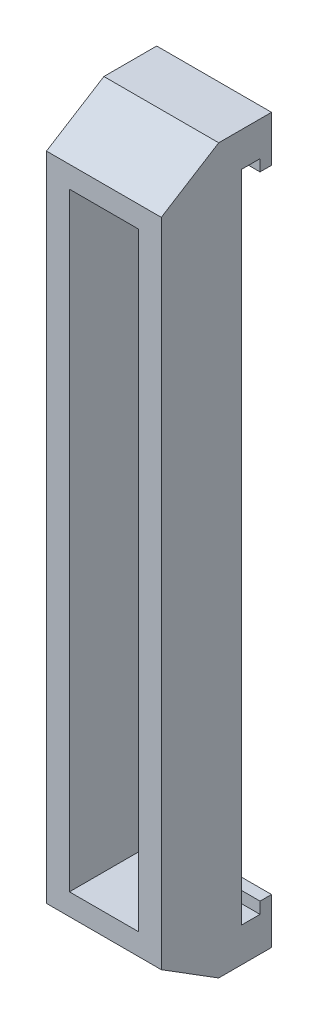
ISO-10303-21;
HEADER;
FILE_DESCRIPTION(('STEP AP214'),'2;1');
FILE_NAME('part.step','',(''),(''),'','','');
FILE_SCHEMA(('AUTOMOTIVE_DESIGN { 1 0 10303 214 1 1 1 1 }'));
ENDSEC;
DATA;
#1=APPLICATION_CONTEXT('core data for automotive mechanical design processes');
#2=APPLICATION_PROTOCOL_DEFINITION('international standard','automotive_design',2000,#1);
#3=PRODUCT_CONTEXT('',#1,'mechanical');
#4=PRODUCT('Part','Part','',(#3));
#5=PRODUCT_RELATED_PRODUCT_CATEGORY('part','',(#4));
#6=PRODUCT_DEFINITION_FORMATION('','',#4);
#7=PRODUCT_DEFINITION_CONTEXT('part definition',#1,'design');
#8=PRODUCT_DEFINITION('design','',#6,#7);
#9=PRODUCT_DEFINITION_SHAPE('','',#8);
#10=(LENGTH_UNIT() NAMED_UNIT(*) SI_UNIT(.MILLI.,.METRE.));
#11=(NAMED_UNIT(*) PLANE_ANGLE_UNIT() SI_UNIT($,.RADIAN.));
#12=(NAMED_UNIT(*) SI_UNIT($,.STERADIAN.) SOLID_ANGLE_UNIT());
#13=UNCERTAINTY_MEASURE_WITH_UNIT(LENGTH_MEASURE(1.E-05),#10,'distance_accuracy_value','');
#14=(GEOMETRIC_REPRESENTATION_CONTEXT(3) GLOBAL_UNCERTAINTY_ASSIGNED_CONTEXT((#13)) GLOBAL_UNIT_ASSIGNED_CONTEXT((#10,
#11,#12)) REPRESENTATION_CONTEXT('',''));
#15=CARTESIAN_POINT('',(0.,0.,0.));
#16=DIRECTION('',(0.,0.,1.));
#17=DIRECTION('',(1.,0.,0.));
#18=AXIS2_PLACEMENT_3D('',#15,#16,#17);
#19=CARTESIAN_POINT('',(0.,0.,7.));
#20=DIRECTION('',(1.,0.,0.));
#21=DIRECTION('',(0.,0.,-1.));
#22=AXIS2_PLACEMENT_3D('',#19,#20,#21);
#23=PLANE('',#22);
#24=DIRECTION('',(0.,0.,-1.));
#25=VECTOR('',#24,1.);
#26=CARTESIAN_POINT('',(0.,0.,7.));
#27=LINE('',#26,#25);
#28=CARTESIAN_POINT('',(0.,0.,1.99999999999997));
#29=VERTEX_POINT('',#28);
#30=CARTESIAN_POINT('',(0.,0.,-2.6));
#31=VERTEX_POINT('',#30);
#32=EDGE_CURVE('E213',#29,#31,#27,.T.);
#33=ORIENTED_EDGE('',*,*,#32,.F.);
#34=DIRECTION('',(0.,-0.529919264233203,-0.848048096156427));
#35=VECTOR('',#34,1.);
#36=CARTESIAN_POINT('',(0.,3.12434675954664,7.));
#37=LINE('',#36,#35);
#38=CARTESIAN_POINT('',(0.,3.12434675954664,7.));
#39=VERTEX_POINT('',#38);
#40=EDGE_CURVE('E48',#29,#39,#37,.F.);
#41=ORIENTED_EDGE('',*,*,#40,.T.);
#42=DIRECTION('',(0.,-1.,0.));
#43=VECTOR('',#42,1.);
#44=CARTESIAN_POINT('',(0.,0.,7.));
#45=LINE('',#44,#43);
#46=CARTESIAN_POINT('',(0.,59.8756532404534,7.));
#47=VERTEX_POINT('',#46);
#48=EDGE_CURVE('E192',#47,#39,#45,.T.);
#49=ORIENTED_EDGE('',*,*,#48,.F.);
#50=DIRECTION('',(0.,-0.529919264233203,0.848048096156427));
#51=VECTOR('',#50,1.);
#52=CARTESIAN_POINT('',(0.,59.8756532404534,7.));
#53=LINE('',#52,#51);
#54=CARTESIAN_POINT('',(0.,63.,1.99999999999998));
#55=VERTEX_POINT('',#54);
#56=EDGE_CURVE('E63',#47,#55,#53,.F.);
#57=ORIENTED_EDGE('',*,*,#56,.T.);
#58=DIRECTION('',(0.,0.,-1.));
#59=VECTOR('',#58,1.);
#60=CARTESIAN_POINT('',(0.,63.,7.));
#61=LINE('',#60,#59);
#62=CARTESIAN_POINT('',(0.,63.,-2.6));
#63=VERTEX_POINT('',#62);
#64=EDGE_CURVE('E204',#55,#63,#61,.T.);
#65=ORIENTED_EDGE('',*,*,#64,.T.);
#66=DIRECTION('',(0.,-1.,0.));
#67=VECTOR('',#66,1.);
#68=CARTESIAN_POINT('',(0.,63.,-2.6));
#69=LINE('',#68,#67);
#70=CARTESIAN_POINT('',(0.,59.,-2.6));
#71=VERTEX_POINT('',#70);
#72=EDGE_CURVE('E257',#63,#71,#69,.T.);
#73=ORIENTED_EDGE('',*,*,#72,.T.);
#74=DIRECTION('',(0.,0.,1.));
#75=VECTOR('',#74,1.);
#76=CARTESIAN_POINT('',(0.,59.,-2.6));
#77=LINE('',#76,#75);
#78=CARTESIAN_POINT('',(0.,59.,-1.6));
#79=VERTEX_POINT('',#78);
#80=EDGE_CURVE('E308',#71,#79,#77,.T.);
#81=ORIENTED_EDGE('',*,*,#80,.T.);
#82=DIRECTION('',(0.,1.,0.));
#83=VECTOR('',#82,1.);
#84=CARTESIAN_POINT('',(0.,59.,-1.6));
#85=LINE('',#84,#83);
#86=CARTESIAN_POINT('',(0.,60.,-1.6));
#87=VERTEX_POINT('',#86);
#88=EDGE_CURVE('E312',#79,#87,#85,.T.);
#89=ORIENTED_EDGE('',*,*,#88,.T.);
#90=DIRECTION('',(0.,0.,1.));
#91=VECTOR('',#90,1.);
#92=CARTESIAN_POINT('',(0.,60.,-1.6));
#93=LINE('',#92,#91);
#94=CARTESIAN_POINT('',(0.,60.,0.));
#95=VERTEX_POINT('',#94);
#96=EDGE_CURVE('E293',#87,#95,#93,.T.);
#97=ORIENTED_EDGE('',*,*,#96,.T.);
#98=DIRECTION('',(0.,-1.,0.));
#99=VECTOR('',#98,1.);
#100=CARTESIAN_POINT('',(0.,0.,0.));
#101=LINE('',#100,#99);
#102=CARTESIAN_POINT('',(0.,3.,0.));
#103=VERTEX_POINT('',#102);
#104=EDGE_CURVE('E193',#95,#103,#101,.T.);
#105=ORIENTED_EDGE('',*,*,#104,.T.);
#106=DIRECTION('',(0.,0.,-1.));
#107=VECTOR('',#106,1.);
#108=CARTESIAN_POINT('',(0.,3.,-1.6));
#109=LINE('',#108,#107);
#110=CARTESIAN_POINT('',(0.,3.,-1.6));
#111=VERTEX_POINT('',#110);
#112=EDGE_CURVE('E170',#103,#111,#109,.T.);
#113=ORIENTED_EDGE('',*,*,#112,.T.);
#114=DIRECTION('',(0.,1.,0.));
#115=VECTOR('',#114,1.);
#116=CARTESIAN_POINT('',(0.,4.,-1.6));
#117=LINE('',#116,#115);
#118=CARTESIAN_POINT('',(0.,4.,-1.6));
#119=VERTEX_POINT('',#118);
#120=EDGE_CURVE('E271',#111,#119,#117,.T.);
#121=ORIENTED_EDGE('',*,*,#120,.T.);
#122=DIRECTION('',(0.,0.,-1.));
#123=VECTOR('',#122,1.);
#124=CARTESIAN_POINT('',(0.,4.,-2.6));
#125=LINE('',#124,#123);
#126=CARTESIAN_POINT('',(0.,4.,-2.6));
#127=VERTEX_POINT('',#126);
#128=EDGE_CURVE('E275',#119,#127,#125,.T.);
#129=ORIENTED_EDGE('',*,*,#128,.T.);
#130=DIRECTION('',(0.,-1.,0.));
#131=VECTOR('',#130,1.);
#132=CARTESIAN_POINT('',(0.,0.,-2.6));
#133=LINE('',#132,#131);
#134=EDGE_CURVE('E184',#127,#31,#133,.T.);
#135=ORIENTED_EDGE('',*,*,#134,.T.);
#136=EDGE_LOOP('',(#33,#41,#49,#57,#65,#73,#81,#89,#97,#105,#113,#121,#129,#135));
#137=FACE_BOUND('',#136,.T.);
#138=ADVANCED_FACE('F39',(#137),#23,.F.);
#139=CARTESIAN_POINT('',(0.,0.,7.));
#140=DIRECTION('',(0.,1.,0.));
#141=DIRECTION('',(0.,0.,1.));
#142=AXIS2_PLACEMENT_3D('',#139,#140,#141);
#143=PLANE('',#142);
#144=DIRECTION('',(0.,0.,-1.));
#145=VECTOR('',#144,1.);
#146=CARTESIAN_POINT('',(10.,0.,7.));
#147=LINE('',#146,#145);
#148=CARTESIAN_POINT('',(10.,0.,1.99999999999997));
#149=VERTEX_POINT('',#148);
#150=CARTESIAN_POINT('',(10.,0.,-2.6));
#151=VERTEX_POINT('',#150);
#152=EDGE_CURVE('E210',#149,#151,#147,.T.);
#153=ORIENTED_EDGE('',*,*,#152,.F.);
#154=DIRECTION('',(-1.,0.,0.));
#155=VECTOR('',#154,1.);
#156=CARTESIAN_POINT('',(0.,0.,1.99999999999997));
#157=LINE('',#156,#155);
#158=EDGE_CURVE('E230',#149,#29,#157,.T.);
#159=ORIENTED_EDGE('',*,*,#158,.T.);
#160=ORIENTED_EDGE('',*,*,#32,.T.);
#161=DIRECTION('',(-1.,0.,0.));
#162=VECTOR('',#161,1.);
#163=CARTESIAN_POINT('',(10.,0.,-2.6));
#164=LINE('',#163,#162);
#165=EDGE_CURVE('E252',#151,#31,#164,.T.);
#166=ORIENTED_EDGE('',*,*,#165,.F.);
#167=EDGE_LOOP('',(#153,#159,#160,#166));
#168=FACE_BOUND('',#167,.T.);
#169=ADVANCED_FACE('F250',(#168),#143,.F.);
#170=CARTESIAN_POINT('',(10.,0.,7.));
#171=DIRECTION('',(-1.,0.,0.));
#172=DIRECTION('',(0.,0.,1.));
#173=AXIS2_PLACEMENT_3D('',#170,#171,#172);
#174=PLANE('',#173);
#175=DIRECTION('',(0.,1.,0.));
#176=VECTOR('',#175,1.);
#177=CARTESIAN_POINT('',(10.,0.,7.));
#178=LINE('',#177,#176);
#179=CARTESIAN_POINT('',(10.,3.12434675954664,7.));
#180=VERTEX_POINT('',#179);
#181=CARTESIAN_POINT('',(10.,59.8756532404534,7.));
#182=VERTEX_POINT('',#181);
#183=EDGE_CURVE('E198',#180,#182,#178,.T.);
#184=ORIENTED_EDGE('',*,*,#183,.F.);
#185=DIRECTION('',(0.,0.529919264233203,0.848048096156427));
#186=VECTOR('',#185,1.);
#187=CARTESIAN_POINT('',(10.,3.12434675954664,7.));
#188=LINE('',#187,#186);
#189=EDGE_CURVE('E227',#180,#149,#188,.F.);
#190=ORIENTED_EDGE('',*,*,#189,.T.);
#191=ORIENTED_EDGE('',*,*,#152,.T.);
#192=DIRECTION('',(0.,-1.,0.));
#193=VECTOR('',#192,1.);
#194=CARTESIAN_POINT('',(10.,0.,-2.6));
#195=LINE('',#194,#193);
#196=CARTESIAN_POINT('',(10.,4.,-2.6));
#197=VERTEX_POINT('',#196);
#198=EDGE_CURVE('E175',#197,#151,#195,.T.);
#199=ORIENTED_EDGE('',*,*,#198,.F.);
#200=DIRECTION('',(0.,0.,-1.));
#201=VECTOR('',#200,1.);
#202=CARTESIAN_POINT('',(10.,4.,-2.6));
#203=LINE('',#202,#201);
#204=CARTESIAN_POINT('',(10.,4.,-1.6));
#205=VERTEX_POINT('',#204);
#206=EDGE_CURVE('E263',#205,#197,#203,.T.);
#207=ORIENTED_EDGE('',*,*,#206,.F.);
#208=DIRECTION('',(0.,1.,0.));
#209=VECTOR('',#208,1.);
#210=CARTESIAN_POINT('',(10.,4.,-1.6));
#211=LINE('',#210,#209);
#212=CARTESIAN_POINT('',(10.,3.,-1.6));
#213=VERTEX_POINT('',#212);
#214=EDGE_CURVE('E182',#213,#205,#211,.T.);
#215=ORIENTED_EDGE('',*,*,#214,.F.);
#216=DIRECTION('',(0.,0.,-1.));
#217=VECTOR('',#216,1.);
#218=CARTESIAN_POINT('',(10.,3.,-1.6));
#219=LINE('',#218,#217);
#220=CARTESIAN_POINT('',(10.,3.,0.));
#221=VERTEX_POINT('',#220);
#222=EDGE_CURVE('E168',#221,#213,#219,.T.);
#223=ORIENTED_EDGE('',*,*,#222,.F.);
#224=DIRECTION('',(0.,1.,0.));
#225=VECTOR('',#224,1.);
#226=CARTESIAN_POINT('',(10.,0.,0.));
#227=LINE('',#226,#225);
#228=CARTESIAN_POINT('',(10.,60.,0.));
#229=VERTEX_POINT('',#228);
#230=EDGE_CURVE('E55',#221,#229,#227,.T.);
#231=ORIENTED_EDGE('',*,*,#230,.T.);
#232=DIRECTION('',(0.,0.,1.));
#233=VECTOR('',#232,1.);
#234=CARTESIAN_POINT('',(10.,60.,-1.6));
#235=LINE('',#234,#233);
#236=CARTESIAN_POINT('',(10.,60.,-1.6));
#237=VERTEX_POINT('',#236);
#238=EDGE_CURVE('E301',#237,#229,#235,.T.);
#239=ORIENTED_EDGE('',*,*,#238,.F.);
#240=DIRECTION('',(0.,1.,0.));
#241=VECTOR('',#240,1.);
#242=CARTESIAN_POINT('',(10.,59.,-1.6));
#243=LINE('',#242,#241);
#244=CARTESIAN_POINT('',(10.,59.,-1.6));
#245=VERTEX_POINT('',#244);
#246=EDGE_CURVE('E297',#245,#237,#243,.T.);
#247=ORIENTED_EDGE('',*,*,#246,.F.);
#248=DIRECTION('',(0.,0.,1.));
#249=VECTOR('',#248,1.);
#250=CARTESIAN_POINT('',(10.,59.,-2.6));
#251=LINE('',#250,#249);
#252=CARTESIAN_POINT('',(10.,59.,-2.6));
#253=VERTEX_POINT('',#252);
#254=EDGE_CURVE('E292',#253,#245,#251,.T.);
#255=ORIENTED_EDGE('',*,*,#254,.F.);
#256=DIRECTION('',(0.,-1.,0.));
#257=VECTOR('',#256,1.);
#258=CARTESIAN_POINT('',(10.,63.,-2.6));
#259=LINE('',#258,#257);
#260=CARTESIAN_POINT('',(10.,63.,-2.6));
#261=VERTEX_POINT('',#260);
#262=EDGE_CURVE('E288',#261,#253,#259,.T.);
#263=ORIENTED_EDGE('',*,*,#262,.F.);
#264=DIRECTION('',(0.,0.,-1.));
#265=VECTOR('',#264,1.);
#266=CARTESIAN_POINT('',(10.,63.,7.));
#267=LINE('',#266,#265);
#268=CARTESIAN_POINT('',(10.,63.,1.99999999999998));
#269=VERTEX_POINT('',#268);
#270=EDGE_CURVE('E207',#269,#261,#267,.T.);
#271=ORIENTED_EDGE('',*,*,#270,.F.);
#272=DIRECTION('',(0.,0.529919264233203,-0.848048096156427));
#273=VECTOR('',#272,1.);
#274=CARTESIAN_POINT('',(10.,59.8756532404534,7.));
#275=LINE('',#274,#273);
#276=EDGE_CURVE('E224',#269,#182,#275,.F.);
#277=ORIENTED_EDGE('',*,*,#276,.T.);
#278=EDGE_LOOP('',(#184,#190,#191,#199,#207,#215,#223,#231,#239,#247,#255,#263,#271,#277));
#279=FACE_BOUND('',#278,.T.);
#280=ADVANCED_FACE('F179',(#279),#174,.F.);
#281=CARTESIAN_POINT('',(0.,63.,7.));
#282=DIRECTION('',(0.,-1.,0.));
#283=DIRECTION('',(0.,0.,-1.));
#284=AXIS2_PLACEMENT_3D('',#281,#282,#283);
#285=PLANE('',#284);
#286=ORIENTED_EDGE('',*,*,#64,.F.);
#287=DIRECTION('',(1.,0.,0.));
#288=VECTOR('',#287,1.);
#289=CARTESIAN_POINT('',(0.,63.,1.99999999999998));
#290=LINE('',#289,#288);
#291=EDGE_CURVE('E11',#55,#269,#290,.T.);
#292=ORIENTED_EDGE('',*,*,#291,.T.);
#293=ORIENTED_EDGE('',*,*,#270,.T.);
#294=DIRECTION('',(-1.,0.,0.));
#295=VECTOR('',#294,1.);
#296=CARTESIAN_POINT('',(10.,63.,-2.6));
#297=LINE('',#296,#295);
#298=EDGE_CURVE('E304',#261,#63,#297,.T.);
#299=ORIENTED_EDGE('',*,*,#298,.T.);
#300=EDGE_LOOP('',(#286,#292,#293,#299));
#301=FACE_BOUND('',#300,.T.);
#302=ADVANCED_FACE('F381',(#301),#285,.F.);
#303=CARTESIAN_POINT('',(0.,0.,7.));
#304=DIRECTION('',(0.,0.,-1.));
#305=DIRECTION('',(-1.,0.,0.));
#306=AXIS2_PLACEMENT_3D('',#303,#304,#305);
#307=PLANE('',#306);
#308=DIRECTION('',(1.,0.,0.));
#309=VECTOR('',#308,1.);
#310=CARTESIAN_POINT('',(2.,5.,7.));
#311=LINE('',#310,#309);
#312=CARTESIAN_POINT('',(2.,5.,7.));
#313=VERTEX_POINT('',#312);
#314=CARTESIAN_POINT('',(8.,5.,7.));
#315=VERTEX_POINT('',#314);
#316=EDGE_CURVE('E348',#313,#315,#311,.T.);
#317=ORIENTED_EDGE('',*,*,#316,.F.);
#318=DIRECTION('',(0.,-1.,0.));
#319=VECTOR('',#318,1.);
#320=CARTESIAN_POINT('',(2.,5.,7.));
#321=LINE('',#320,#319);
#322=CARTESIAN_POINT('',(2.,58.,7.));
#323=VERTEX_POINT('',#322);
#324=EDGE_CURVE('E345',#323,#313,#321,.T.);
#325=ORIENTED_EDGE('',*,*,#324,.F.);
#326=DIRECTION('',(-1.,0.,0.));
#327=VECTOR('',#326,1.);
#328=CARTESIAN_POINT('',(2.,58.,7.));
#329=LINE('',#328,#327);
#330=CARTESIAN_POINT('',(8.,58.,7.));
#331=VERTEX_POINT('',#330);
#332=EDGE_CURVE('E356',#331,#323,#329,.T.);
#333=ORIENTED_EDGE('',*,*,#332,.F.);
#334=DIRECTION('',(0.,1.,0.));
#335=VECTOR('',#334,1.);
#336=CARTESIAN_POINT('',(8.,5.,7.));
#337=LINE('',#336,#335);
#338=EDGE_CURVE('E352',#315,#331,#337,.T.);
#339=ORIENTED_EDGE('',*,*,#338,.F.);
#340=EDGE_LOOP('',(#317,#325,#333,#339));
#341=FACE_BOUND('',#340,.T.);
#342=ORIENTED_EDGE('',*,*,#48,.T.);
#343=DIRECTION('',(1.,0.,0.));
#344=VECTOR('',#343,1.);
#345=CARTESIAN_POINT('',(0.,3.12434675954664,7.));
#346=LINE('',#345,#344);
#347=EDGE_CURVE('E220',#39,#180,#346,.T.);
#348=ORIENTED_EDGE('',*,*,#347,.T.);
#349=ORIENTED_EDGE('',*,*,#183,.T.);
#350=DIRECTION('',(-1.,0.,0.));
#351=VECTOR('',#350,1.);
#352=CARTESIAN_POINT('',(0.,59.8756532404534,7.));
#353=LINE('',#352,#351);
#354=EDGE_CURVE('E216',#182,#47,#353,.T.);
#355=ORIENTED_EDGE('',*,*,#354,.T.);
#356=EDGE_LOOP('',(#342,#348,#349,#355));
#357=FACE_BOUND('',#356,.T.);
#358=ADVANCED_FACE('F242',(#341,#357),#307,.F.);
#359=CARTESIAN_POINT('',(0.,0.,0.));
#360=DIRECTION('',(0.,0.,-1.));
#361=DIRECTION('',(-1.,0.,0.));
#362=AXIS2_PLACEMENT_3D('',#359,#360,#361);
#363=PLANE('',#362);
#364=DIRECTION('',(-1.,0.,0.));
#365=VECTOR('',#364,1.);
#366=CARTESIAN_POINT('',(10.,3.,0.));
#367=LINE('',#366,#365);
#368=EDGE_CURVE('E166',#221,#103,#367,.T.);
#369=ORIENTED_EDGE('',*,*,#368,.T.);
#370=ORIENTED_EDGE('',*,*,#104,.F.);
#371=DIRECTION('',(-1.,0.,0.));
#372=VECTOR('',#371,1.);
#373=CARTESIAN_POINT('',(10.,60.,0.));
#374=LINE('',#373,#372);
#375=EDGE_CURVE('E189',#229,#95,#374,.T.);
#376=ORIENTED_EDGE('',*,*,#375,.F.);
#377=ORIENTED_EDGE('',*,*,#230,.F.);
#378=EDGE_LOOP('',(#369,#370,#376,#377));
#379=FACE_BOUND('',#378,.T.);
#380=DIRECTION('',(0.,-1.,0.));
#381=VECTOR('',#380,1.);
#382=CARTESIAN_POINT('',(2.,5.,0.));
#383=LINE('',#382,#381);
#384=CARTESIAN_POINT('',(2.,58.,0.));
#385=VERTEX_POINT('',#384);
#386=CARTESIAN_POINT('',(2.,5.,0.));
#387=VERTEX_POINT('',#386);
#388=EDGE_CURVE('E341',#385,#387,#383,.T.);
#389=ORIENTED_EDGE('',*,*,#388,.T.);
#390=DIRECTION('',(1.,0.,0.));
#391=VECTOR('',#390,1.);
#392=CARTESIAN_POINT('',(2.,5.,0.));
#393=LINE('',#392,#391);
#394=CARTESIAN_POINT('',(8.,5.,0.));
#395=VERTEX_POINT('',#394);
#396=EDGE_CURVE('E200',#387,#395,#393,.T.);
#397=ORIENTED_EDGE('',*,*,#396,.T.);
#398=DIRECTION('',(0.,1.,0.));
#399=VECTOR('',#398,1.);
#400=CARTESIAN_POINT('',(8.,5.,0.));
#401=LINE('',#400,#399);
#402=CARTESIAN_POINT('',(8.,58.,0.));
#403=VERTEX_POINT('',#402);
#404=EDGE_CURVE('E321',#395,#403,#401,.T.);
#405=ORIENTED_EDGE('',*,*,#404,.T.);
#406=DIRECTION('',(-1.,0.,0.));
#407=VECTOR('',#406,1.);
#408=CARTESIAN_POINT('',(2.,58.,0.));
#409=LINE('',#408,#407);
#410=EDGE_CURVE('E337',#403,#385,#409,.T.);
#411=ORIENTED_EDGE('',*,*,#410,.T.);
#412=EDGE_LOOP('',(#389,#397,#405,#411));
#413=FACE_BOUND('',#412,.T.);
#414=ADVANCED_FACE('F186',(#379,#413),#363,.T.);
#415=CARTESIAN_POINT('',(2.,5.,-0.00100000000000013));
#416=DIRECTION('',(-1.,0.,0.));
#417=DIRECTION('',(0.,0.,1.));
#418=AXIS2_PLACEMENT_3D('',#415,#416,#417);
#419=PLANE('',#418);
#420=DIRECTION('',(0.,0.,1.));
#421=VECTOR('',#420,1.);
#422=CARTESIAN_POINT('',(2.,58.,-0.00100000000000013));
#423=LINE('',#422,#421);
#424=EDGE_CURVE('E361',#385,#323,#423,.T.);
#425=ORIENTED_EDGE('',*,*,#424,.T.);
#426=ORIENTED_EDGE('',*,*,#324,.T.);
#427=DIRECTION('',(0.,0.,1.));
#428=VECTOR('',#427,1.);
#429=CARTESIAN_POINT('',(2.,5.,-0.00100000000000013));
#430=LINE('',#429,#428);
#431=EDGE_CURVE('E360',#387,#313,#430,.T.);
#432=ORIENTED_EDGE('',*,*,#431,.F.);
#433=ORIENTED_EDGE('',*,*,#388,.F.);
#434=EDGE_LOOP('',(#425,#426,#432,#433));
#435=FACE_BOUND('',#434,.T.);
#436=ADVANCED_FACE('F436',(#435),#419,.F.);
#437=CARTESIAN_POINT('',(2.,58.,-0.00100000000000013));
#438=DIRECTION('',(0.,1.,0.));
#439=DIRECTION('',(0.,0.,1.));
#440=AXIS2_PLACEMENT_3D('',#437,#438,#439);
#441=PLANE('',#440);
#442=DIRECTION('',(0.,0.,1.));
#443=VECTOR('',#442,1.);
#444=CARTESIAN_POINT('',(8.,58.,-0.00100000000000013));
#445=LINE('',#444,#443);
#446=EDGE_CURVE('E364',#403,#331,#445,.T.);
#447=ORIENTED_EDGE('',*,*,#446,.T.);
#448=ORIENTED_EDGE('',*,*,#332,.T.);
#449=ORIENTED_EDGE('',*,*,#424,.F.);
#450=ORIENTED_EDGE('',*,*,#410,.F.);
#451=EDGE_LOOP('',(#447,#448,#449,#450));
#452=FACE_BOUND('',#451,.T.);
#453=ADVANCED_FACE('F431',(#452),#441,.F.);
#454=CARTESIAN_POINT('',(8.,5.,-0.00100000000000013));
#455=DIRECTION('',(1.,0.,0.));
#456=DIRECTION('',(0.,0.,-1.));
#457=AXIS2_PLACEMENT_3D('',#454,#455,#456);
#458=PLANE('',#457);
#459=DIRECTION('',(0.,0.,1.));
#460=VECTOR('',#459,1.);
#461=CARTESIAN_POINT('',(8.,5.,-0.00100000000000013));
#462=LINE('',#461,#460);
#463=EDGE_CURVE('E367',#395,#315,#462,.T.);
#464=ORIENTED_EDGE('',*,*,#463,.T.);
#465=ORIENTED_EDGE('',*,*,#338,.T.);
#466=ORIENTED_EDGE('',*,*,#446,.F.);
#467=ORIENTED_EDGE('',*,*,#404,.F.);
#468=EDGE_LOOP('',(#464,#465,#466,#467));
#469=FACE_BOUND('',#468,.T.);
#470=ADVANCED_FACE('F425',(#469),#458,.F.);
#471=CARTESIAN_POINT('',(2.,5.,-0.00100000000000013));
#472=DIRECTION('',(0.,-1.,0.));
#473=DIRECTION('',(0.,0.,-1.));
#474=AXIS2_PLACEMENT_3D('',#471,#472,#473);
#475=PLANE('',#474);
#476=ORIENTED_EDGE('',*,*,#431,.T.);
#477=ORIENTED_EDGE('',*,*,#316,.T.);
#478=ORIENTED_EDGE('',*,*,#463,.F.);
#479=ORIENTED_EDGE('',*,*,#396,.F.);
#480=EDGE_LOOP('',(#476,#477,#478,#479));
#481=FACE_BOUND('',#480,.T.);
#482=ADVANCED_FACE('F420',(#481),#475,.F.);
#483=CARTESIAN_POINT('',(0.,3.12434675954664,7.));
#484=DIRECTION('',(0.,0.848048096156427,-0.529919264233203));
#485=DIRECTION('',(1.,0.,0.));
#486=AXIS2_PLACEMENT_3D('',#483,#484,#485);
#487=PLANE('',#486);
#488=ORIENTED_EDGE('',*,*,#40,.F.);
#489=ORIENTED_EDGE('',*,*,#158,.F.);
#490=ORIENTED_EDGE('',*,*,#189,.F.);
#491=ORIENTED_EDGE('',*,*,#347,.F.);
#492=EDGE_LOOP('',(#488,#489,#490,#491));
#493=FACE_BOUND('',#492,.T.);
#494=ADVANCED_FACE('F245',(#493),#487,.F.);
#495=CARTESIAN_POINT('',(0.,59.8756532404534,7.));
#496=DIRECTION('',(0.,-0.848048096156427,-0.529919264233203));
#497=DIRECTION('',(-1.,0.,0.));
#498=AXIS2_PLACEMENT_3D('',#495,#496,#497);
#499=PLANE('',#498);
#500=ORIENTED_EDGE('',*,*,#276,.F.);
#501=ORIENTED_EDGE('',*,*,#291,.F.);
#502=ORIENTED_EDGE('',*,*,#56,.F.);
#503=ORIENTED_EDGE('',*,*,#354,.F.);
#504=EDGE_LOOP('',(#500,#501,#502,#503));
#505=FACE_BOUND('',#504,.T.);
#506=ADVANCED_FACE('F41',(#505),#499,.F.);
#507=CARTESIAN_POINT('',(10.,60.,-1.6));
#508=DIRECTION('',(0.,-1.,0.));
#509=DIRECTION('',(0.,0.,-1.));
#510=AXIS2_PLACEMENT_3D('',#507,#508,#509);
#511=PLANE('',#510);
#512=ORIENTED_EDGE('',*,*,#96,.F.);
#513=DIRECTION('',(-1.,0.,0.));
#514=VECTOR('',#513,1.);
#515=CARTESIAN_POINT('',(10.,60.,-1.6));
#516=LINE('',#515,#514);
#517=EDGE_CURVE('E322',#237,#87,#516,.T.);
#518=ORIENTED_EDGE('',*,*,#517,.F.);
#519=ORIENTED_EDGE('',*,*,#238,.T.);
#520=ORIENTED_EDGE('',*,*,#375,.T.);
#521=EDGE_LOOP('',(#512,#518,#519,#520));
#522=FACE_BOUND('',#521,.T.);
#523=ADVANCED_FACE('F397',(#522),#511,.T.);
#524=CARTESIAN_POINT('',(10.,59.,-1.6));
#525=DIRECTION('',(0.,0.,1.));
#526=DIRECTION('',(1.,0.,0.));
#527=AXIS2_PLACEMENT_3D('',#524,#525,#526);
#528=PLANE('',#527);
#529=ORIENTED_EDGE('',*,*,#88,.F.);
#530=DIRECTION('',(-1.,0.,0.));
#531=VECTOR('',#530,1.);
#532=CARTESIAN_POINT('',(10.,59.,-1.6));
#533=LINE('',#532,#531);
#534=EDGE_CURVE('E325',#245,#79,#533,.T.);
#535=ORIENTED_EDGE('',*,*,#534,.F.);
#536=ORIENTED_EDGE('',*,*,#246,.T.);
#537=ORIENTED_EDGE('',*,*,#517,.T.);
#538=EDGE_LOOP('',(#529,#535,#536,#537));
#539=FACE_BOUND('',#538,.T.);
#540=ADVANCED_FACE('F395',(#539),#528,.T.);
#541=CARTESIAN_POINT('',(10.,59.,-2.6));
#542=DIRECTION('',(0.,-1.,0.));
#543=DIRECTION('',(0.,0.,-1.));
#544=AXIS2_PLACEMENT_3D('',#541,#542,#543);
#545=PLANE('',#544);
#546=ORIENTED_EDGE('',*,*,#80,.F.);
#547=DIRECTION('',(-1.,0.,0.));
#548=VECTOR('',#547,1.);
#549=CARTESIAN_POINT('',(10.,59.,-2.6));
#550=LINE('',#549,#548);
#551=EDGE_CURVE('E328',#253,#71,#550,.T.);
#552=ORIENTED_EDGE('',*,*,#551,.F.);
#553=ORIENTED_EDGE('',*,*,#254,.T.);
#554=ORIENTED_EDGE('',*,*,#534,.T.);
#555=EDGE_LOOP('',(#546,#552,#553,#554));
#556=FACE_BOUND('',#555,.T.);
#557=ADVANCED_FACE('F393',(#556),#545,.T.);
#558=CARTESIAN_POINT('',(10.,63.,-2.6));
#559=DIRECTION('',(0.,0.,-1.));
#560=DIRECTION('',(0.,1.,0.));
#561=AXIS2_PLACEMENT_3D('',#558,#559,#560);
#562=PLANE('',#561);
#563=ORIENTED_EDGE('',*,*,#72,.F.);
#564=ORIENTED_EDGE('',*,*,#298,.F.);
#565=ORIENTED_EDGE('',*,*,#262,.T.);
#566=ORIENTED_EDGE('',*,*,#551,.T.);
#567=EDGE_LOOP('',(#563,#564,#565,#566));
#568=FACE_BOUND('',#567,.T.);
#569=ADVANCED_FACE('F388',(#568),#562,.T.);
#570=CARTESIAN_POINT('',(10.,0.,-2.6));
#571=DIRECTION('',(0.,0.,-1.));
#572=DIRECTION('',(-1.,0.,0.));
#573=AXIS2_PLACEMENT_3D('',#570,#571,#572);
#574=PLANE('',#573);
#575=ORIENTED_EDGE('',*,*,#134,.F.);
#576=DIRECTION('',(-1.,0.,0.));
#577=VECTOR('',#576,1.);
#578=CARTESIAN_POINT('',(10.,4.,-2.6));
#579=LINE('',#578,#577);
#580=EDGE_CURVE('E258',#197,#127,#579,.T.);
#581=ORIENTED_EDGE('',*,*,#580,.F.);
#582=ORIENTED_EDGE('',*,*,#198,.T.);
#583=ORIENTED_EDGE('',*,*,#165,.T.);
#584=EDGE_LOOP('',(#575,#581,#582,#583));
#585=FACE_BOUND('',#584,.T.);
#586=ADVANCED_FACE('F260',(#585),#574,.T.);
#587=CARTESIAN_POINT('',(10.,4.,-2.6));
#588=DIRECTION('',(0.,1.,0.));
#589=DIRECTION('',(0.,0.,1.));
#590=AXIS2_PLACEMENT_3D('',#587,#588,#589);
#591=PLANE('',#590);
#592=ORIENTED_EDGE('',*,*,#128,.F.);
#593=DIRECTION('',(-1.,0.,0.));
#594=VECTOR('',#593,1.);
#595=CARTESIAN_POINT('',(10.,4.,-1.6));
#596=LINE('',#595,#594);
#597=EDGE_CURVE('E283',#205,#119,#596,.T.);
#598=ORIENTED_EDGE('',*,*,#597,.F.);
#599=ORIENTED_EDGE('',*,*,#206,.T.);
#600=ORIENTED_EDGE('',*,*,#580,.T.);
#601=EDGE_LOOP('',(#592,#598,#599,#600));
#602=FACE_BOUND('',#601,.T.);
#603=ADVANCED_FACE('F403',(#602),#591,.T.);
#604=CARTESIAN_POINT('',(10.,4.,-1.6));
#605=DIRECTION('',(0.,0.,1.));
#606=DIRECTION('',(1.,0.,0.));
#607=AXIS2_PLACEMENT_3D('',#604,#605,#606);
#608=PLANE('',#607);
#609=ORIENTED_EDGE('',*,*,#120,.F.);
#610=DIRECTION('',(-1.,0.,0.));
#611=VECTOR('',#610,1.);
#612=CARTESIAN_POINT('',(10.,3.,-1.6));
#613=LINE('',#612,#611);
#614=EDGE_CURVE('E174',#213,#111,#613,.T.);
#615=ORIENTED_EDGE('',*,*,#614,.F.);
#616=ORIENTED_EDGE('',*,*,#214,.T.);
#617=ORIENTED_EDGE('',*,*,#597,.T.);
#618=EDGE_LOOP('',(#609,#615,#616,#617));
#619=FACE_BOUND('',#618,.T.);
#620=ADVANCED_FACE('F401',(#619),#608,.T.);
#621=CARTESIAN_POINT('',(10.,3.,-1.6));
#622=DIRECTION('',(0.,1.,0.));
#623=DIRECTION('',(0.,0.,1.));
#624=AXIS2_PLACEMENT_3D('',#621,#622,#623);
#625=PLANE('',#624);
#626=ORIENTED_EDGE('',*,*,#112,.F.);
#627=ORIENTED_EDGE('',*,*,#368,.F.);
#628=ORIENTED_EDGE('',*,*,#222,.T.);
#629=ORIENTED_EDGE('',*,*,#614,.T.);
#630=EDGE_LOOP('',(#626,#627,#628,#629));
#631=FACE_BOUND('',#630,.T.);
#632=ADVANCED_FACE('F167',(#631),#625,.T.);
#633=CLOSED_SHELL('',(#138,#169,#280,#302,#358,#414,#436,#453,#470,#482,#494,#506,#523,#540,
#557,#569,#586,#603,#620,#632));
#634=MANIFOLD_SOLID_BREP('B2',#633);
#635=ADVANCED_BREP_SHAPE_REPRESENTATION('',(#18,#634),#14);
#636=SHAPE_DEFINITION_REPRESENTATION(#9,#635);
ENDSEC;
END-ISO-10303-21;
